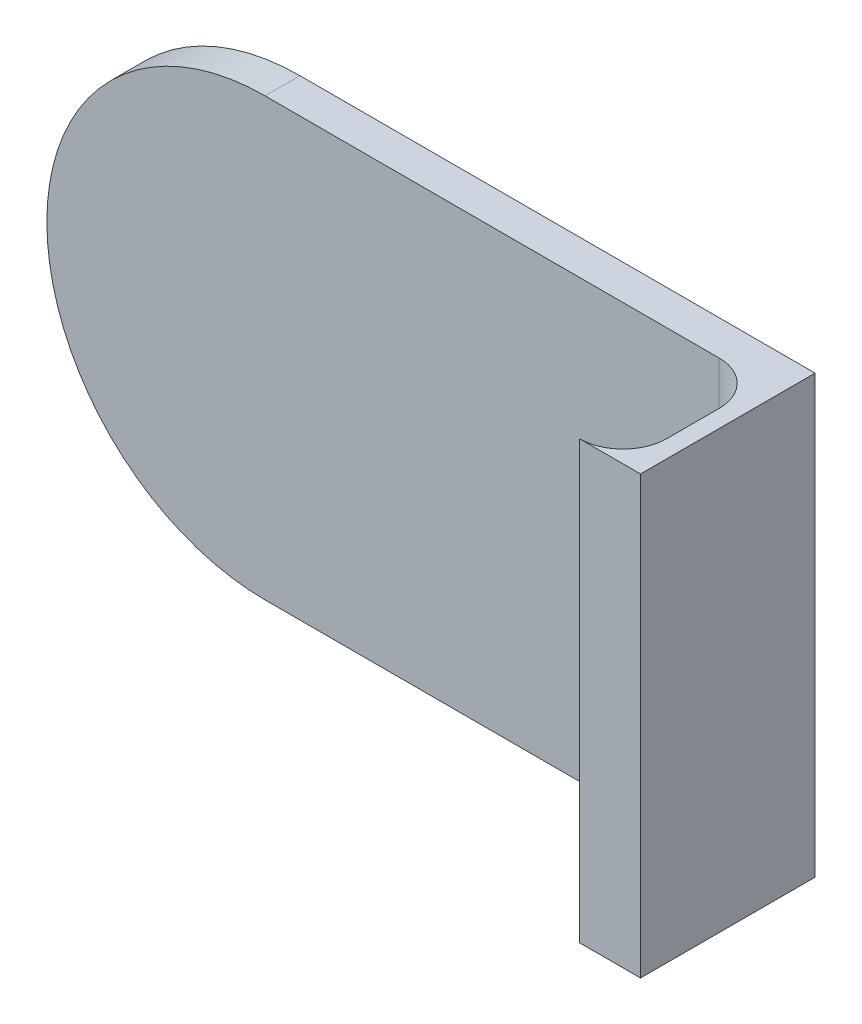
ISO-10303-21;
HEADER;
FILE_DESCRIPTION(('STEP AP214'),'2;1');
FILE_NAME('part.step','',(''),(''),'','','');
FILE_SCHEMA(('AUTOMOTIVE_DESIGN { 1 0 10303 214 1 1 1 1 }'));
ENDSEC;
DATA;
#1=APPLICATION_CONTEXT('core data for automotive mechanical design processes');
#2=APPLICATION_PROTOCOL_DEFINITION('international standard','automotive_design',2000,#1);
#3=PRODUCT_CONTEXT('',#1,'mechanical');
#4=PRODUCT('Part','Part','',(#3));
#5=PRODUCT_RELATED_PRODUCT_CATEGORY('part','',(#4));
#6=PRODUCT_DEFINITION_FORMATION('','',#4);
#7=PRODUCT_DEFINITION_CONTEXT('part definition',#1,'design');
#8=PRODUCT_DEFINITION('design','',#6,#7);
#9=PRODUCT_DEFINITION_SHAPE('','',#8);
#10=(LENGTH_UNIT() NAMED_UNIT(*) SI_UNIT(.MILLI.,.METRE.));
#11=(NAMED_UNIT(*) PLANE_ANGLE_UNIT() SI_UNIT($,.RADIAN.));
#12=(NAMED_UNIT(*) SI_UNIT($,.STERADIAN.) SOLID_ANGLE_UNIT());
#13=UNCERTAINTY_MEASURE_WITH_UNIT(LENGTH_MEASURE(1.E-05),#10,'distance_accuracy_value','');
#14=(GEOMETRIC_REPRESENTATION_CONTEXT(3) GLOBAL_UNCERTAINTY_ASSIGNED_CONTEXT((#13)) GLOBAL_UNIT_ASSIGNED_CONTEXT((#10,
#11,#12)) REPRESENTATION_CONTEXT('',''));
#15=CARTESIAN_POINT('',(0.,0.,0.));
#16=DIRECTION('',(0.,0.,1.));
#17=DIRECTION('',(1.,0.,0.));
#18=AXIS2_PLACEMENT_3D('',#15,#16,#17);
#19=CARTESIAN_POINT('',(-0.01,0.,0.02));
#20=DIRECTION('',(0.,0.,1.));
#21=DIRECTION('',(1.,0.,0.));
#22=AXIS2_PLACEMENT_3D('',#19,#20,#21);
#23=PLANE('',#22);
#24=DIRECTION('',(1.,0.,0.));
#25=VECTOR('',#24,1.);
#26=CARTESIAN_POINT('',(1.8625,-1.125,0.02));
#27=LINE('',#26,#25);
#28=CARTESIAN_POINT('',(1.715,-1.125,0.02));
#29=VERTEX_POINT('',#28);
#30=CARTESIAN_POINT('',(1.975,-1.125,0.02));
#31=VERTEX_POINT('',#30);
#32=EDGE_CURVE('E95',#29,#31,#27,.T.);
#33=ORIENTED_EDGE('',*,*,#32,.F.);
#34=CARTESIAN_POINT('',(1.715,-1.25,0.02));
#35=DIRECTION('',(0.,0.,-1.));
#36=DIRECTION('',(-1.,0.,0.));
#37=AXIS2_PLACEMENT_3D('',#34,#35,#36);
#38=CIRCLE('',#37,0.125);
#39=CARTESIAN_POINT('',(1.715,-1.375,0.02));
#40=VERTEX_POINT('',#39);
#41=EDGE_CURVE('E20',#40,#29,#38,.T.);
#42=ORIENTED_EDGE('',*,*,#41,.F.);
#43=DIRECTION('',(1.,0.,0.));
#44=VECTOR('',#43,1.);
#45=CARTESIAN_POINT('',(1.8625,-1.375,0.02));
#46=LINE('',#45,#44);
#47=CARTESIAN_POINT('',(1.975,-1.375,0.02));
#48=VERTEX_POINT('',#47);
#49=EDGE_CURVE('E79',#48,#40,#46,.F.);
#50=ORIENTED_EDGE('',*,*,#49,.F.);
#51=DIRECTION('',(0.,1.,0.));
#52=VECTOR('',#51,1.);
#53=CARTESIAN_POINT('',(1.975,0.,0.02));
#54=LINE('',#53,#52);
#55=EDGE_CURVE('E120',#48,#31,#54,.T.);
#56=ORIENTED_EDGE('',*,*,#55,.T.);
#57=EDGE_LOOP('',(#33,#42,#50,#56));
#58=FACE_BOUND('',#57,.T.);
#59=ADVANCED_FACE('F17',(#58),#23,.T.);
#60=CARTESIAN_POINT('',(1.975,0.,0.045));
#61=DIRECTION('',(0.,1.,0.));
#62=DIRECTION('',(0.,0.,1.));
#63=AXIS2_PLACEMENT_3D('',#60,#61,#62);
#64=CYLINDRICAL_SURFACE('',#63,0.025);
#65=DIRECTION('',(0.,1.,0.));
#66=VECTOR('',#65,1.);
#67=CARTESIAN_POINT('',(2.,0.,0.045));
#68=LINE('',#67,#66);
#69=CARTESIAN_POINT('',(2.,-1.125,0.045));
#70=VERTEX_POINT('',#69);
#71=CARTESIAN_POINT('',(2.,-1.375,0.045));
#72=VERTEX_POINT('',#71);
#73=EDGE_CURVE('E118',#70,#72,#68,.F.);
#74=ORIENTED_EDGE('',*,*,#73,.F.);
#75=CARTESIAN_POINT('',(1.975,-1.125,0.045));
#76=DIRECTION('',(0.,1.,0.));
#77=DIRECTION('',(0.,0.,1.));
#78=AXIS2_PLACEMENT_3D('',#75,#76,#77);
#79=CIRCLE('',#78,0.025);
#80=EDGE_CURVE('E128',#31,#70,#79,.F.);
#81=ORIENTED_EDGE('',*,*,#80,.F.);
#82=ORIENTED_EDGE('',*,*,#55,.F.);
#83=CARTESIAN_POINT('',(1.975,-1.375,0.045));
#84=DIRECTION('',(0.,1.,0.));
#85=DIRECTION('',(0.,0.,1.));
#86=AXIS2_PLACEMENT_3D('',#83,#84,#85);
#87=CIRCLE('',#86,0.025);
#88=EDGE_CURVE('E89',#72,#48,#87,.T.);
#89=ORIENTED_EDGE('',*,*,#88,.F.);
#90=EDGE_LOOP('',(#74,#81,#82,#89));
#91=FACE_BOUND('',#90,.T.);
#92=ADVANCED_FACE('F136',(#91),#64,.F.);
#93=CARTESIAN_POINT('',(2.,0.,0.06));
#94=DIRECTION('',(-1.,0.,0.));
#95=DIRECTION('',(0.,0.,1.));
#96=AXIS2_PLACEMENT_3D('',#93,#94,#95);
#97=PLANE('',#96);
#98=DIRECTION('',(0.,0.,-1.));
#99=VECTOR('',#98,1.);
#100=CARTESIAN_POINT('',(2.,-1.375,0.));
#101=LINE('',#100,#99);
#102=CARTESIAN_POINT('',(2.,-1.375,0.075));
#103=VERTEX_POINT('',#102);
#104=EDGE_CURVE('E99',#103,#72,#101,.T.);
#105=ORIENTED_EDGE('',*,*,#104,.F.);
#106=DIRECTION('',(0.,-1.,0.));
#107=VECTOR('',#106,1.);
#108=CARTESIAN_POINT('',(2.,0.,0.075));
#109=LINE('',#108,#107);
#110=CARTESIAN_POINT('',(2.,-1.125,0.075));
#111=VERTEX_POINT('',#110);
#112=EDGE_CURVE('E115',#103,#111,#109,.F.);
#113=ORIENTED_EDGE('',*,*,#112,.T.);
#114=DIRECTION('',(0.,0.,1.));
#115=VECTOR('',#114,1.);
#116=CARTESIAN_POINT('',(2.,-1.125,0.));
#117=LINE('',#116,#115);
#118=EDGE_CURVE('E127',#70,#111,#117,.T.);
#119=ORIENTED_EDGE('',*,*,#118,.F.);
#120=ORIENTED_EDGE('',*,*,#73,.T.);
#121=EDGE_LOOP('',(#105,#113,#119,#120));
#122=FACE_BOUND('',#121,.T.);
#123=ADVANCED_FACE('F179',(#122),#97,.T.);
#124=CARTESIAN_POINT('',(1.975,0.,0.075));
#125=DIRECTION('',(0.,-1.,0.));
#126=DIRECTION('',(0.,0.,-1.));
#127=AXIS2_PLACEMENT_3D('',#124,#125,#126);
#128=CYLINDRICAL_SURFACE('',#127,0.025);
#129=DIRECTION('',(0.,1.,0.));
#130=VECTOR('',#129,1.);
#131=CARTESIAN_POINT('',(1.975,-1.125,0.1));
#132=LINE('',#131,#130);
#133=CARTESIAN_POINT('',(1.975,-1.125,0.1));
#134=VERTEX_POINT('',#133);
#135=CARTESIAN_POINT('',(1.975,-1.375,0.1));
#136=VERTEX_POINT('',#135);
#137=EDGE_CURVE('E100',#134,#136,#132,.F.);
#138=ORIENTED_EDGE('',*,*,#137,.F.);
#139=CARTESIAN_POINT('',(1.975,-1.125,0.075));
#140=DIRECTION('',(0.,-1.,0.));
#141=DIRECTION('',(0.,0.,-1.));
#142=AXIS2_PLACEMENT_3D('',#139,#140,#141);
#143=CIRCLE('',#142,0.025);
#144=EDGE_CURVE('E124',#111,#134,#143,.T.);
#145=ORIENTED_EDGE('',*,*,#144,.F.);
#146=ORIENTED_EDGE('',*,*,#112,.F.);
#147=CARTESIAN_POINT('',(1.975,-1.375,0.075));
#148=DIRECTION('',(0.,-1.,0.));
#149=DIRECTION('',(0.,0.,-1.));
#150=AXIS2_PLACEMENT_3D('',#147,#148,#149);
#151=CIRCLE('',#150,0.025);
#152=EDGE_CURVE('E105',#136,#103,#151,.F.);
#153=ORIENTED_EDGE('',*,*,#152,.F.);
#154=EDGE_LOOP('',(#138,#145,#146,#153));
#155=FACE_BOUND('',#154,.T.);
#156=ADVANCED_FACE('F178',(#155),#128,.F.);
#157=CARTESIAN_POINT('',(1.715,-1.125,0.1));
#158=DIRECTION('',(0.,0.,1.));
#159=DIRECTION('',(1.,0.,0.));
#160=AXIS2_PLACEMENT_3D('',#157,#158,#159);
#161=PLANE('',#160);
#162=ORIENTED_EDGE('',*,*,#137,.T.);
#163=DIRECTION('',(1.,0.,0.));
#164=VECTOR('',#163,1.);
#165=CARTESIAN_POINT('',(1.8625,-1.375,0.1));
#166=LINE('',#165,#164);
#167=CARTESIAN_POINT('',(2.01,-1.375,0.1));
#168=VERTEX_POINT('',#167);
#169=EDGE_CURVE('E103',#168,#136,#166,.F.);
#170=ORIENTED_EDGE('',*,*,#169,.F.);
#171=DIRECTION('',(0.,1.,0.));
#172=VECTOR('',#171,1.);
#173=CARTESIAN_POINT('',(2.01,-1.25,0.1));
#174=LINE('',#173,#172);
#175=CARTESIAN_POINT('',(2.01,-1.125,0.1));
#176=VERTEX_POINT('',#175);
#177=EDGE_CURVE('E109',#176,#168,#174,.F.);
#178=ORIENTED_EDGE('',*,*,#177,.F.);
#179=DIRECTION('',(1.,0.,0.));
#180=VECTOR('',#179,1.);
#181=CARTESIAN_POINT('',(1.8625,-1.125,0.1));
#182=LINE('',#181,#180);
#183=EDGE_CURVE('E126',#134,#176,#182,.T.);
#184=ORIENTED_EDGE('',*,*,#183,.F.);
#185=EDGE_LOOP('',(#162,#170,#178,#184));
#186=FACE_BOUND('',#185,.T.);
#187=ADVANCED_FACE('F176',(#186),#161,.T.);
#188=CARTESIAN_POINT('',(1.715,-1.25,0.));
#189=DIRECTION('',(0.,0.,-1.));
#190=DIRECTION('',(-1.,0.,0.));
#191=AXIS2_PLACEMENT_3D('',#188,#189,#190);
#192=CYLINDRICAL_SURFACE('',#191,0.125);
#193=CARTESIAN_POINT('',(1.715,-1.25,0.));
#194=DIRECTION('',(0.,0.,-1.));
#195=DIRECTION('',(-1.,0.,0.));
#196=AXIS2_PLACEMENT_3D('',#193,#194,#195);
#197=CIRCLE('',#196,0.125);
#198=CARTESIAN_POINT('',(1.715,-1.125,0.));
#199=VERTEX_POINT('',#198);
#200=CARTESIAN_POINT('',(1.715,-1.375,0.));
#201=VERTEX_POINT('',#200);
#202=EDGE_CURVE('E102',#199,#201,#197,.F.);
#203=ORIENTED_EDGE('',*,*,#202,.T.);
#204=DIRECTION('',(0.,0.,-1.));
#205=VECTOR('',#204,1.);
#206=CARTESIAN_POINT('',(1.715,-1.375,0.));
#207=LINE('',#206,#205);
#208=EDGE_CURVE('E85',#40,#201,#207,.T.);
#209=ORIENTED_EDGE('',*,*,#208,.F.);
#210=ORIENTED_EDGE('',*,*,#41,.T.);
#211=DIRECTION('',(0.,0.,1.));
#212=VECTOR('',#211,1.);
#213=CARTESIAN_POINT('',(1.715,-1.125,0.));
#214=LINE('',#213,#212);
#215=EDGE_CURVE('E140',#199,#29,#214,.T.);
#216=ORIENTED_EDGE('',*,*,#215,.F.);
#217=EDGE_LOOP('',(#203,#209,#210,#216));
#218=FACE_BOUND('',#217,.T.);
#219=ADVANCED_FACE('F101',(#218),#192,.T.);
#220=CARTESIAN_POINT('',(1.8625,-1.375,0.));
#221=DIRECTION('',(0.,-1.,0.));
#222=DIRECTION('',(0.,0.,-1.));
#223=AXIS2_PLACEMENT_3D('',#220,#221,#222);
#224=PLANE('',#223);
#225=ORIENTED_EDGE('',*,*,#169,.T.);
#226=ORIENTED_EDGE('',*,*,#152,.T.);
#227=ORIENTED_EDGE('',*,*,#104,.T.);
#228=ORIENTED_EDGE('',*,*,#88,.T.);
#229=ORIENTED_EDGE('',*,*,#49,.T.);
#230=ORIENTED_EDGE('',*,*,#208,.T.);
#231=DIRECTION('',(1.,0.,0.));
#232=VECTOR('',#231,1.);
#233=CARTESIAN_POINT('',(1.822568790891,-1.375,0.));
#234=LINE('',#233,#232);
#235=CARTESIAN_POINT('',(2.01,-1.375,0.));
#236=VERTEX_POINT('',#235);
#237=EDGE_CURVE('E123',#201,#236,#234,.T.);
#238=ORIENTED_EDGE('',*,*,#237,.T.);
#239=DIRECTION('',(0.,0.,-1.));
#240=VECTOR('',#239,1.);
#241=CARTESIAN_POINT('',(2.01,-1.375,0.));
#242=LINE('',#241,#240);
#243=EDGE_CURVE('E111',#168,#236,#242,.T.);
#244=ORIENTED_EDGE('',*,*,#243,.F.);
#245=EDGE_LOOP('',(#225,#226,#227,#228,#229,#230,#238,#244));
#246=FACE_BOUND('',#245,.T.);
#247=ADVANCED_FACE('F82',(#246),#224,.T.);
#248=CARTESIAN_POINT('',(2.01,-1.25,0.));
#249=DIRECTION('',(1.,0.,0.));
#250=DIRECTION('',(0.,0.,-1.));
#251=AXIS2_PLACEMENT_3D('',#248,#249,#250);
#252=PLANE('',#251);
#253=ORIENTED_EDGE('',*,*,#177,.T.);
#254=ORIENTED_EDGE('',*,*,#243,.T.);
#255=DIRECTION('',(0.,1.,0.));
#256=VECTOR('',#255,1.);
#257=CARTESIAN_POINT('',(2.01,-1.25,0.));
#258=LINE('',#257,#256);
#259=CARTESIAN_POINT('',(2.01,-1.125,0.));
#260=VERTEX_POINT('',#259);
#261=EDGE_CURVE('E26',#236,#260,#258,.T.);
#262=ORIENTED_EDGE('',*,*,#261,.T.);
#263=DIRECTION('',(0.,0.,1.));
#264=VECTOR('',#263,1.);
#265=CARTESIAN_POINT('',(2.01,-1.125,0.));
#266=LINE('',#265,#264);
#267=EDGE_CURVE('E34',#176,#260,#266,.F.);
#268=ORIENTED_EDGE('',*,*,#267,.F.);
#269=EDGE_LOOP('',(#253,#254,#262,#268));
#270=FACE_BOUND('',#269,.T.);
#271=ADVANCED_FACE('F160',(#270),#252,.T.);
#272=CARTESIAN_POINT('',(1.8625,-1.125,0.));
#273=DIRECTION('',(0.,1.,0.));
#274=DIRECTION('',(0.,0.,1.));
#275=AXIS2_PLACEMENT_3D('',#272,#273,#274);
#276=PLANE('',#275);
#277=ORIENTED_EDGE('',*,*,#183,.T.);
#278=ORIENTED_EDGE('',*,*,#267,.T.);
#279=DIRECTION('',(1.,0.,0.));
#280=VECTOR('',#279,1.);
#281=CARTESIAN_POINT('',(1.822568790891,-1.125,0.));
#282=LINE('',#281,#280);
#283=EDGE_CURVE('E11',#260,#199,#282,.F.);
#284=ORIENTED_EDGE('',*,*,#283,.T.);
#285=ORIENTED_EDGE('',*,*,#215,.T.);
#286=ORIENTED_EDGE('',*,*,#32,.T.);
#287=ORIENTED_EDGE('',*,*,#80,.T.);
#288=ORIENTED_EDGE('',*,*,#118,.T.);
#289=ORIENTED_EDGE('',*,*,#144,.T.);
#290=EDGE_LOOP('',(#277,#278,#284,#285,#286,#287,#288,#289));
#291=FACE_BOUND('',#290,.T.);
#292=ADVANCED_FACE('F139',(#291),#276,.T.);
#293=CARTESIAN_POINT('',(1.822568790891,-1.25,0.));
#294=DIRECTION('',(0.,0.,1.));
#295=DIRECTION('',(1.,0.,0.));
#296=AXIS2_PLACEMENT_3D('',#293,#294,#295);
#297=PLANE('',#296);
#298=ORIENTED_EDGE('',*,*,#261,.F.);
#299=ORIENTED_EDGE('',*,*,#237,.F.);
#300=ORIENTED_EDGE('',*,*,#202,.F.);
#301=ORIENTED_EDGE('',*,*,#283,.F.);
#302=EDGE_LOOP('',(#298,#299,#300,#301));
#303=FACE_BOUND('',#302,.T.);
#304=ADVANCED_FACE('F164',(#303),#297,.F.);
#305=CLOSED_SHELL('',(#59,#92,#123,#156,#187,#219,#247,#271,#292,#304));
#306=MANIFOLD_SOLID_BREP('B1',#305);
#307=ADVANCED_BREP_SHAPE_REPRESENTATION('',(#18,#306),#14);
#308=SHAPE_DEFINITION_REPRESENTATION(#9,#307);
ENDSEC;
END-ISO-10303-21;
